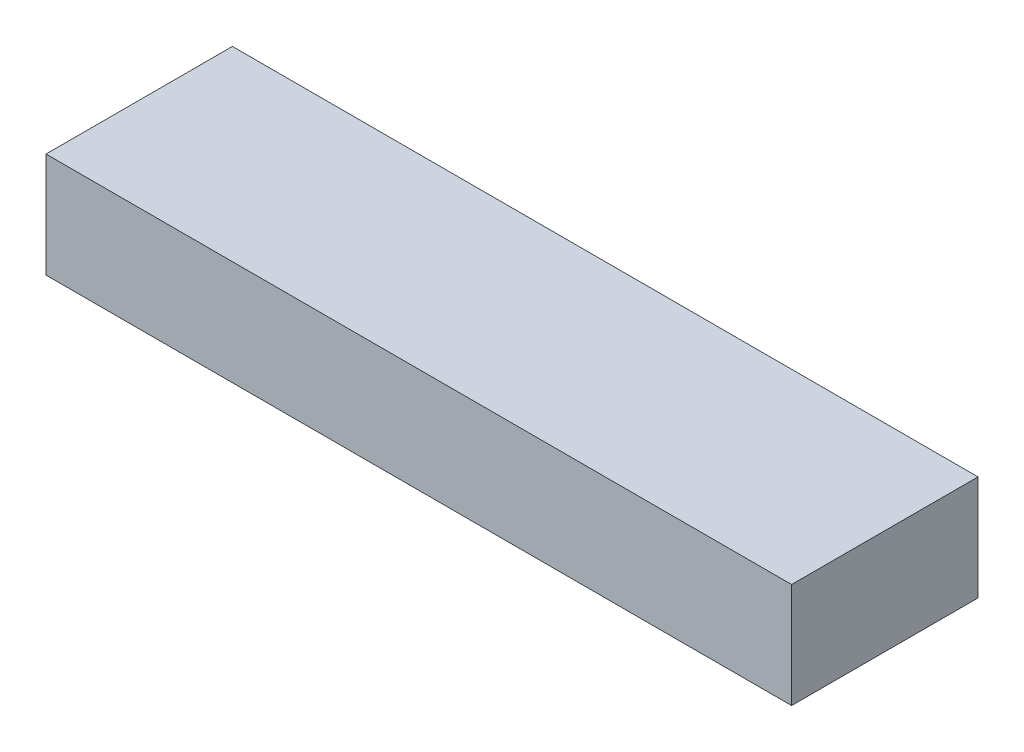
ISO-10303-21;
HEADER;
FILE_DESCRIPTION(('STEP AP214'),'2;1');
FILE_NAME('part.step','',(''),(''),'','','');
FILE_SCHEMA(('AUTOMOTIVE_DESIGN { 1 0 10303 214 1 1 1 1 }'));
ENDSEC;
DATA;
#1=APPLICATION_CONTEXT('core data for automotive mechanical design processes');
#2=APPLICATION_PROTOCOL_DEFINITION('international standard','automotive_design',2000,#1);
#3=PRODUCT_CONTEXT('',#1,'mechanical');
#4=PRODUCT('Part','Part','',(#3));
#5=PRODUCT_RELATED_PRODUCT_CATEGORY('part','',(#4));
#6=PRODUCT_DEFINITION_FORMATION('','',#4);
#7=PRODUCT_DEFINITION_CONTEXT('part definition',#1,'design');
#8=PRODUCT_DEFINITION('design','',#6,#7);
#9=PRODUCT_DEFINITION_SHAPE('','',#8);
#10=(LENGTH_UNIT() NAMED_UNIT(*) SI_UNIT(.MILLI.,.METRE.));
#11=(NAMED_UNIT(*) PLANE_ANGLE_UNIT() SI_UNIT($,.RADIAN.));
#12=(NAMED_UNIT(*) SI_UNIT($,.STERADIAN.) SOLID_ANGLE_UNIT());
#13=UNCERTAINTY_MEASURE_WITH_UNIT(LENGTH_MEASURE(1.E-05),#10,'distance_accuracy_value','');
#14=(GEOMETRIC_REPRESENTATION_CONTEXT(3) GLOBAL_UNCERTAINTY_ASSIGNED_CONTEXT((#13)) GLOBAL_UNIT_ASSIGNED_CONTEXT((#10,
#11,#12)) REPRESENTATION_CONTEXT('',''));
#15=CARTESIAN_POINT('',(0.,0.,0.));
#16=DIRECTION('',(0.,0.,1.));
#17=DIRECTION('',(1.,0.,0.));
#18=AXIS2_PLACEMENT_3D('',#15,#16,#17);
#19=CARTESIAN_POINT('',(-101.6,14.2875,0.));
#20=DIRECTION('',(1.,0.,0.));
#21=DIRECTION('',(0.,0.,-1.));
#22=AXIS2_PLACEMENT_3D('',#19,#20,#21);
#23=PLANE('',#22);
#24=DIRECTION('',(0.,0.,1.));
#25=VECTOR('',#24,1.);
#26=CARTESIAN_POINT('',(-101.6,0.,0.));
#27=LINE('',#26,#25);
#28=CARTESIAN_POINT('',(-101.6,0.,0.));
#29=VERTEX_POINT('',#28);
#30=CARTESIAN_POINT('',(-101.6,0.,25.4));
#31=VERTEX_POINT('',#30);
#32=EDGE_CURVE('E99',#29,#31,#27,.T.);
#33=ORIENTED_EDGE('',*,*,#32,.T.);
#34=DIRECTION('',(0.,-1.,0.));
#35=VECTOR('',#34,1.);
#36=CARTESIAN_POINT('',(-101.6,14.2875,25.4));
#37=LINE('',#36,#35);
#38=CARTESIAN_POINT('',(-101.6,14.2875,25.4));
#39=VERTEX_POINT('',#38);
#40=EDGE_CURVE('E11',#39,#31,#37,.T.);
#41=ORIENTED_EDGE('',*,*,#40,.F.);
#42=DIRECTION('',(0.,0.,1.));
#43=VECTOR('',#42,1.);
#44=CARTESIAN_POINT('',(-101.6,14.2875,0.));
#45=LINE('',#44,#43);
#46=CARTESIAN_POINT('',(-101.6,14.2875,0.));
#47=VERTEX_POINT('',#46);
#48=EDGE_CURVE('E87',#47,#39,#45,.T.);
#49=ORIENTED_EDGE('',*,*,#48,.F.);
#50=DIRECTION('',(0.,-1.,0.));
#51=VECTOR('',#50,1.);
#52=CARTESIAN_POINT('',(-101.6,14.2875,0.));
#53=LINE('',#52,#51);
#54=EDGE_CURVE('E95',#47,#29,#53,.T.);
#55=ORIENTED_EDGE('',*,*,#54,.T.);
#56=EDGE_LOOP('',(#33,#41,#49,#55));
#57=FACE_BOUND('',#56,.T.);
#58=ADVANCED_FACE('F36',(#57),#23,.F.);
#59=CARTESIAN_POINT('',(-101.6,14.2875,25.4));
#60=DIRECTION('',(0.,0.,-1.));
#61=DIRECTION('',(-1.,0.,0.));
#62=AXIS2_PLACEMENT_3D('',#59,#60,#61);
#63=PLANE('',#62);
#64=DIRECTION('',(1.,0.,0.));
#65=VECTOR('',#64,1.);
#66=CARTESIAN_POINT('',(-101.6,0.,25.4));
#67=LINE('',#66,#65);
#68=CARTESIAN_POINT('',(0.,0.,25.4));
#69=VERTEX_POINT('',#68);
#70=EDGE_CURVE('E91',#31,#69,#67,.T.);
#71=ORIENTED_EDGE('',*,*,#70,.T.);
#72=DIRECTION('',(0.,-1.,0.));
#73=VECTOR('',#72,1.);
#74=CARTESIAN_POINT('',(0.,14.2875,25.4));
#75=LINE('',#74,#73);
#76=CARTESIAN_POINT('',(0.,14.2875,25.4));
#77=VERTEX_POINT('',#76);
#78=EDGE_CURVE('E44',#77,#69,#75,.T.);
#79=ORIENTED_EDGE('',*,*,#78,.F.);
#80=DIRECTION('',(1.,0.,0.));
#81=VECTOR('',#80,1.);
#82=CARTESIAN_POINT('',(-101.6,14.2875,25.4));
#83=LINE('',#82,#81);
#84=EDGE_CURVE('E82',#39,#77,#83,.T.);
#85=ORIENTED_EDGE('',*,*,#84,.F.);
#86=ORIENTED_EDGE('',*,*,#40,.T.);
#87=EDGE_LOOP('',(#71,#79,#85,#86));
#88=FACE_BOUND('',#87,.T.);
#89=ADVANCED_FACE('F90',(#88),#63,.F.);
#90=CARTESIAN_POINT('',(0.,14.2875,0.));
#91=DIRECTION('',(-1.,0.,0.));
#92=DIRECTION('',(0.,0.,1.));
#93=AXIS2_PLACEMENT_3D('',#90,#91,#92);
#94=PLANE('',#93);
#95=DIRECTION('',(0.,0.,-1.));
#96=VECTOR('',#95,1.);
#97=CARTESIAN_POINT('',(0.,0.,0.));
#98=LINE('',#97,#96);
#99=CARTESIAN_POINT('',(0.,0.,0.));
#100=VERTEX_POINT('',#99);
#101=EDGE_CURVE('E69',#69,#100,#98,.T.);
#102=ORIENTED_EDGE('',*,*,#101,.T.);
#103=DIRECTION('',(0.,-1.,0.));
#104=VECTOR('',#103,1.);
#105=CARTESIAN_POINT('',(0.,14.2875,0.));
#106=LINE('',#105,#104);
#107=CARTESIAN_POINT('',(0.,14.2875,0.));
#108=VERTEX_POINT('',#107);
#109=EDGE_CURVE('E92',#108,#100,#106,.T.);
#110=ORIENTED_EDGE('',*,*,#109,.F.);
#111=DIRECTION('',(0.,0.,-1.));
#112=VECTOR('',#111,1.);
#113=CARTESIAN_POINT('',(0.,14.2875,0.));
#114=LINE('',#113,#112);
#115=EDGE_CURVE('E85',#77,#108,#114,.T.);
#116=ORIENTED_EDGE('',*,*,#115,.F.);
#117=ORIENTED_EDGE('',*,*,#78,.T.);
#118=EDGE_LOOP('',(#102,#110,#116,#117));
#119=FACE_BOUND('',#118,.T.);
#120=ADVANCED_FACE('F93',(#119),#94,.F.);
#121=CARTESIAN_POINT('',(-101.6,14.2875,0.));
#122=DIRECTION('',(0.,0.,1.));
#123=DIRECTION('',(1.,0.,0.));
#124=AXIS2_PLACEMENT_3D('',#121,#122,#123);
#125=PLANE('',#124);
#126=DIRECTION('',(-1.,0.,0.));
#127=VECTOR('',#126,1.);
#128=CARTESIAN_POINT('',(-101.6,0.,0.));
#129=LINE('',#128,#127);
#130=EDGE_CURVE('E75',#100,#29,#129,.T.);
#131=ORIENTED_EDGE('',*,*,#130,.T.);
#132=ORIENTED_EDGE('',*,*,#54,.F.);
#133=DIRECTION('',(-1.,0.,0.));
#134=VECTOR('',#133,1.);
#135=CARTESIAN_POINT('',(-101.6,14.2875,0.));
#136=LINE('',#135,#134);
#137=EDGE_CURVE('E52',#108,#47,#136,.T.);
#138=ORIENTED_EDGE('',*,*,#137,.F.);
#139=ORIENTED_EDGE('',*,*,#109,.T.);
#140=EDGE_LOOP('',(#131,#132,#138,#139));
#141=FACE_BOUND('',#140,.T.);
#142=ADVANCED_FACE('F106',(#141),#125,.F.);
#143=CARTESIAN_POINT('',(-101.6,14.2875,25.4));
#144=DIRECTION('',(0.,1.,0.));
#145=DIRECTION('',(0.,0.,1.));
#146=AXIS2_PLACEMENT_3D('',#143,#144,#145);
#147=PLANE('',#146);
#148=ORIENTED_EDGE('',*,*,#48,.T.);
#149=ORIENTED_EDGE('',*,*,#84,.T.);
#150=ORIENTED_EDGE('',*,*,#115,.T.);
#151=ORIENTED_EDGE('',*,*,#137,.T.);
#152=EDGE_LOOP('',(#148,#149,#150,#151));
#153=FACE_BOUND('',#152,.T.);
#154=ADVANCED_FACE('F83',(#153),#147,.T.);
#155=CARTESIAN_POINT('',(-101.6,0.,25.4));
#156=DIRECTION('',(0.,1.,0.));
#157=DIRECTION('',(0.,0.,1.));
#158=AXIS2_PLACEMENT_3D('',#155,#156,#157);
#159=PLANE('',#158);
#160=ORIENTED_EDGE('',*,*,#32,.F.);
#161=ORIENTED_EDGE('',*,*,#130,.F.);
#162=ORIENTED_EDGE('',*,*,#101,.F.);
#163=ORIENTED_EDGE('',*,*,#70,.F.);
#164=EDGE_LOOP('',(#160,#161,#162,#163));
#165=FACE_BOUND('',#164,.T.);
#166=ADVANCED_FACE('F109',(#165),#159,.F.);
#167=CLOSED_SHELL('',(#58,#89,#120,#142,#154,#166));
#168=MANIFOLD_SOLID_BREP('B2',#167);
#169=ADVANCED_BREP_SHAPE_REPRESENTATION('',(#18,#168),#14);
#170=SHAPE_DEFINITION_REPRESENTATION(#9,#169);
ENDSEC;
END-ISO-10303-21;
